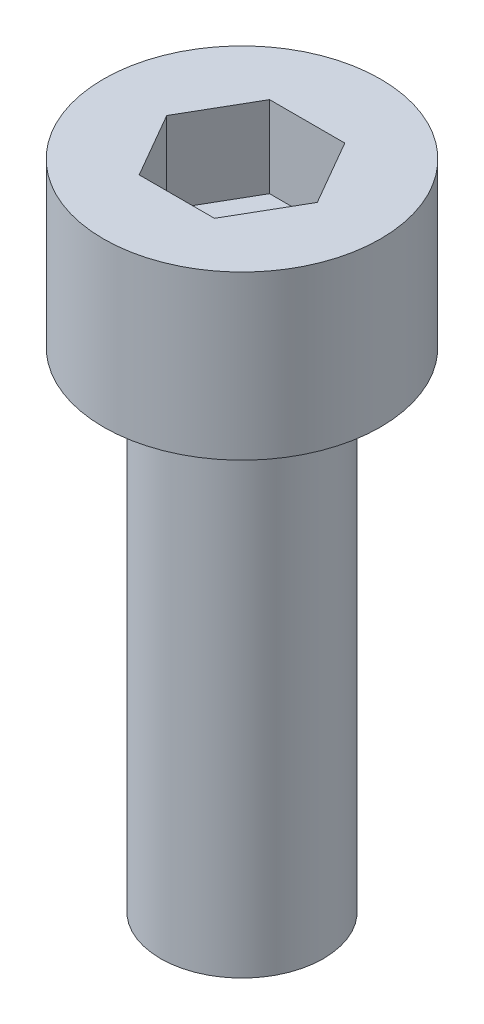
ISO-10303-21;
HEADER;
FILE_DESCRIPTION(('STEP AP214'),'2;1');
FILE_NAME('part.step','',(''),(''),'','','');
FILE_SCHEMA(('AUTOMOTIVE_DESIGN { 1 0 10303 214 1 1 1 1 }'));
ENDSEC;
DATA;
#1=APPLICATION_CONTEXT('core data for automotive mechanical design processes');
#2=APPLICATION_PROTOCOL_DEFINITION('international standard','automotive_design',2000,#1);
#3=PRODUCT_CONTEXT('',#1,'mechanical');
#4=PRODUCT('Part','Part','',(#3));
#5=PRODUCT_RELATED_PRODUCT_CATEGORY('part','',(#4));
#6=PRODUCT_DEFINITION_FORMATION('','',#4);
#7=PRODUCT_DEFINITION_CONTEXT('part definition',#1,'design');
#8=PRODUCT_DEFINITION('design','',#6,#7);
#9=PRODUCT_DEFINITION_SHAPE('','',#8);
#10=(LENGTH_UNIT() NAMED_UNIT(*) SI_UNIT(.MILLI.,.METRE.));
#11=(NAMED_UNIT(*) PLANE_ANGLE_UNIT() SI_UNIT($,.RADIAN.));
#12=(NAMED_UNIT(*) SI_UNIT($,.STERADIAN.) SOLID_ANGLE_UNIT());
#13=UNCERTAINTY_MEASURE_WITH_UNIT(LENGTH_MEASURE(1.E-05),#10,'distance_accuracy_value','');
#14=(GEOMETRIC_REPRESENTATION_CONTEXT(3) GLOBAL_UNCERTAINTY_ASSIGNED_CONTEXT((#13)) GLOBAL_UNIT_ASSIGNED_CONTEXT((#10,
#11,#12)) REPRESENTATION_CONTEXT('',''));
#15=CARTESIAN_POINT('',(0.,0.,0.));
#16=DIRECTION('',(0.,0.,1.));
#17=DIRECTION('',(1.,0.,0.));
#18=AXIS2_PLACEMENT_3D('',#15,#16,#17);
#19=CARTESIAN_POINT('',(0.,0.,0.));
#20=DIRECTION('',(0.,1.,0.));
#21=DIRECTION('',(0.,0.,1.));
#22=AXIS2_PLACEMENT_3D('',#19,#20,#21);
#23=PLANE('',#22);
#24=CARTESIAN_POINT('',(0.,0.,0.));
#25=DIRECTION('',(0.,1.,0.));
#26=DIRECTION('',(0.,0.,1.));
#27=AXIS2_PLACEMENT_3D('',#24,#25,#26);
#28=CIRCLE('',#27,2.5);
#29=CARTESIAN_POINT('',(0.,0.,2.5));
#30=VERTEX_POINT('',#29);
#31=EDGE_CURVE('E11',#30,#30,#28,.T.);
#32=ORIENTED_EDGE('',*,*,#31,.F.);
#33=EDGE_LOOP('',(#32));
#34=FACE_BOUND('',#33,.T.);
#35=ADVANCED_FACE('F33',(#34),#23,.F.);
#36=CARTESIAN_POINT('',(0.,20.,0.));
#37=DIRECTION('',(0.,1.,0.));
#38=DIRECTION('',(0.,0.,1.));
#39=AXIS2_PLACEMENT_3D('',#36,#37,#38);
#40=CYLINDRICAL_SURFACE('',#39,2.5);
#41=CARTESIAN_POINT('',(0.,15.,0.));
#42=DIRECTION('',(0.,1.,0.));
#43=DIRECTION('',(0.,0.,1.));
#44=AXIS2_PLACEMENT_3D('',#41,#42,#43);
#45=CIRCLE('',#44,2.5);
#46=CARTESIAN_POINT('',(0.,15.,2.5));
#47=VERTEX_POINT('',#46);
#48=EDGE_CURVE('E40',#47,#47,#45,.T.);
#49=ORIENTED_EDGE('',*,*,#48,.F.);
#50=EDGE_LOOP('',(#49));
#51=FACE_BOUND('',#50,.T.);
#52=ORIENTED_EDGE('',*,*,#31,.T.);
#53=EDGE_LOOP('',(#52));
#54=FACE_BOUND('',#53,.T.);
#55=ADVANCED_FACE('F149',(#51,#54),#40,.T.);
#56=CARTESIAN_POINT('',(2.5,15.,0.));
#57=DIRECTION('',(0.,1.,0.));
#58=DIRECTION('',(0.,0.,1.));
#59=AXIS2_PLACEMENT_3D('',#56,#57,#58);
#60=PLANE('',#59);
#61=CARTESIAN_POINT('',(0.,15.,0.));
#62=DIRECTION('',(0.,1.,0.));
#63=DIRECTION('',(0.,0.,1.));
#64=AXIS2_PLACEMENT_3D('',#61,#62,#63);
#65=CIRCLE('',#64,4.25);
#66=CARTESIAN_POINT('',(0.,15.,4.25));
#67=VERTEX_POINT('',#66);
#68=EDGE_CURVE('E142',#67,#67,#65,.T.);
#69=ORIENTED_EDGE('',*,*,#68,.F.);
#70=EDGE_LOOP('',(#69));
#71=FACE_BOUND('',#70,.T.);
#72=ORIENTED_EDGE('',*,*,#48,.T.);
#73=EDGE_LOOP('',(#72));
#74=FACE_BOUND('',#73,.T.);
#75=ADVANCED_FACE('F147',(#71,#74),#60,.F.);
#76=CARTESIAN_POINT('',(0.,20.,0.));
#77=DIRECTION('',(0.,1.,0.));
#78=DIRECTION('',(0.,0.,1.));
#79=AXIS2_PLACEMENT_3D('',#76,#77,#78);
#80=CYLINDRICAL_SURFACE('',#79,4.25);
#81=CARTESIAN_POINT('',(0.,20.,0.));
#82=DIRECTION('',(0.,1.,0.));
#83=DIRECTION('',(0.,0.,1.));
#84=AXIS2_PLACEMENT_3D('',#81,#82,#83);
#85=CIRCLE('',#84,4.25);
#86=CARTESIAN_POINT('',(0.,20.,4.25));
#87=VERTEX_POINT('',#86);
#88=EDGE_CURVE('E134',#87,#87,#85,.T.);
#89=ORIENTED_EDGE('',*,*,#88,.F.);
#90=EDGE_LOOP('',(#89));
#91=FACE_BOUND('',#90,.T.);
#92=ORIENTED_EDGE('',*,*,#68,.T.);
#93=EDGE_LOOP('',(#92));
#94=FACE_BOUND('',#93,.T.);
#95=ADVANCED_FACE('F167',(#91,#94),#80,.T.);
#96=CARTESIAN_POINT('',(4.25,20.,0.));
#97=DIRECTION('',(0.,-1.,0.));
#98=DIRECTION('',(0.,0.,-1.));
#99=AXIS2_PLACEMENT_3D('',#96,#97,#98);
#100=PLANE('',#99);
#101=DIRECTION('',(-1.,0.,0.));
#102=VECTOR('',#101,1.);
#103=CARTESIAN_POINT('',(1.15470053837925,20.,-2.));
#104=LINE('',#103,#102);
#105=CARTESIAN_POINT('',(1.15470053837925,20.,-2.));
#106=VERTEX_POINT('',#105);
#107=CARTESIAN_POINT('',(-1.15470053837925,20.,-2.));
#108=VERTEX_POINT('',#107);
#109=EDGE_CURVE('E121',#106,#108,#104,.T.);
#110=ORIENTED_EDGE('',*,*,#109,.F.);
#111=DIRECTION('',(-0.5,0.,-0.866025403784438));
#112=VECTOR('',#111,1.);
#113=CARTESIAN_POINT('',(2.3094010767585,20.,0.));
#114=LINE('',#113,#112);
#115=CARTESIAN_POINT('',(2.3094010767585,20.,0.));
#116=VERTEX_POINT('',#115);
#117=EDGE_CURVE('E47',#116,#106,#114,.T.);
#118=ORIENTED_EDGE('',*,*,#117,.F.);
#119=DIRECTION('',(0.5,0.,-0.866025403784439));
#120=VECTOR('',#119,1.);
#121=CARTESIAN_POINT('',(1.15470053837925,20.,2.));
#122=LINE('',#121,#120);
#123=CARTESIAN_POINT('',(1.15470053837925,20.,2.));
#124=VERTEX_POINT('',#123);
#125=EDGE_CURVE('E130',#124,#116,#122,.T.);
#126=ORIENTED_EDGE('',*,*,#125,.F.);
#127=DIRECTION('',(1.,0.,0.));
#128=VECTOR('',#127,1.);
#129=CARTESIAN_POINT('',(-1.15470053837925,20.,2.));
#130=LINE('',#129,#128);
#131=CARTESIAN_POINT('',(-1.15470053837925,20.,2.));
#132=VERTEX_POINT('',#131);
#133=EDGE_CURVE('E128',#132,#124,#130,.T.);
#134=ORIENTED_EDGE('',*,*,#133,.F.);
#135=DIRECTION('',(0.5,0.,0.866025403784439));
#136=VECTOR('',#135,1.);
#137=CARTESIAN_POINT('',(-2.3094010767585,20.,0.));
#138=LINE('',#137,#136);
#139=CARTESIAN_POINT('',(-2.3094010767585,20.,0.));
#140=VERTEX_POINT('',#139);
#141=EDGE_CURVE('E95',#140,#132,#138,.T.);
#142=ORIENTED_EDGE('',*,*,#141,.F.);
#143=DIRECTION('',(-0.5,0.,0.866025403784438));
#144=VECTOR('',#143,1.);
#145=CARTESIAN_POINT('',(-1.15470053837925,20.,-2.));
#146=LINE('',#145,#144);
#147=EDGE_CURVE('E124',#108,#140,#146,.T.);
#148=ORIENTED_EDGE('',*,*,#147,.F.);
#149=EDGE_LOOP('',(#110,#118,#126,#134,#142,#148));
#150=FACE_BOUND('',#149,.T.);
#151=ORIENTED_EDGE('',*,*,#88,.T.);
#152=EDGE_LOOP('',(#151));
#153=FACE_BOUND('',#152,.T.);
#154=ADVANCED_FACE('F175',(#150,#153),#100,.F.);
#155=CARTESIAN_POINT('',(2.3094010767585,17.5,0.));
#156=DIRECTION('',(0.866025403784438,0.,-0.5));
#157=DIRECTION('',(-0.5,0.,-0.866025403784438));
#158=AXIS2_PLACEMENT_3D('',#155,#156,#157);
#159=PLANE('',#158);
#160=ORIENTED_EDGE('',*,*,#117,.T.);
#161=DIRECTION('',(0.,1.,0.));
#162=VECTOR('',#161,1.);
#163=CARTESIAN_POINT('',(1.15470053837925,17.5,-2.));
#164=LINE('',#163,#162);
#165=CARTESIAN_POINT('',(1.15470053837925,17.5,-2.));
#166=VERTEX_POINT('',#165);
#167=EDGE_CURVE('E77',#166,#106,#164,.T.);
#168=ORIENTED_EDGE('',*,*,#167,.F.);
#169=DIRECTION('',(-0.5,0.,-0.866025403784438));
#170=VECTOR('',#169,1.);
#171=CARTESIAN_POINT('',(2.3094010767585,17.5,0.));
#172=LINE('',#171,#170);
#173=CARTESIAN_POINT('',(2.3094010767585,17.5,0.));
#174=VERTEX_POINT('',#173);
#175=EDGE_CURVE('E132',#174,#166,#172,.T.);
#176=ORIENTED_EDGE('',*,*,#175,.F.);
#177=DIRECTION('',(0.,1.,0.));
#178=VECTOR('',#177,1.);
#179=CARTESIAN_POINT('',(2.3094010767585,17.5,0.));
#180=LINE('',#179,#178);
#181=EDGE_CURVE('E55',#174,#116,#180,.T.);
#182=ORIENTED_EDGE('',*,*,#181,.T.);
#183=EDGE_LOOP('',(#160,#168,#176,#182));
#184=FACE_BOUND('',#183,.T.);
#185=ADVANCED_FACE('F183',(#184),#159,.F.);
#186=CARTESIAN_POINT('',(1.15470053837925,17.5,2.));
#187=DIRECTION('',(0.866025403784439,0.,0.5));
#188=DIRECTION('',(0.5,0.,-0.866025403784439));
#189=AXIS2_PLACEMENT_3D('',#186,#187,#188);
#190=PLANE('',#189);
#191=ORIENTED_EDGE('',*,*,#125,.T.);
#192=ORIENTED_EDGE('',*,*,#181,.F.);
#193=DIRECTION('',(0.5,0.,-0.866025403784439));
#194=VECTOR('',#193,1.);
#195=CARTESIAN_POINT('',(1.15470053837925,17.5,2.));
#196=LINE('',#195,#194);
#197=CARTESIAN_POINT('',(1.15470053837925,17.5,2.));
#198=VERTEX_POINT('',#197);
#199=EDGE_CURVE('E107',#198,#174,#196,.T.);
#200=ORIENTED_EDGE('',*,*,#199,.F.);
#201=DIRECTION('',(0.,1.,0.));
#202=VECTOR('',#201,1.);
#203=CARTESIAN_POINT('',(1.15470053837925,17.5,2.));
#204=LINE('',#203,#202);
#205=EDGE_CURVE('E99',#198,#124,#204,.T.);
#206=ORIENTED_EDGE('',*,*,#205,.T.);
#207=EDGE_LOOP('',(#191,#192,#200,#206));
#208=FACE_BOUND('',#207,.T.);
#209=ADVANCED_FACE('F191',(#208),#190,.F.);
#210=CARTESIAN_POINT('',(-1.15470053837925,17.5,2.));
#211=DIRECTION('',(0.,0.,1.));
#212=DIRECTION('',(1.,0.,0.));
#213=AXIS2_PLACEMENT_3D('',#210,#211,#212);
#214=PLANE('',#213);
#215=ORIENTED_EDGE('',*,*,#133,.T.);
#216=ORIENTED_EDGE('',*,*,#205,.F.);
#217=DIRECTION('',(1.,0.,0.));
#218=VECTOR('',#217,1.);
#219=CARTESIAN_POINT('',(-1.15470053837925,17.5,2.));
#220=LINE('',#219,#218);
#221=CARTESIAN_POINT('',(-1.15470053837925,17.5,2.));
#222=VERTEX_POINT('',#221);
#223=EDGE_CURVE('E103',#222,#198,#220,.T.);
#224=ORIENTED_EDGE('',*,*,#223,.F.);
#225=DIRECTION('',(0.,1.,0.));
#226=VECTOR('',#225,1.);
#227=CARTESIAN_POINT('',(-1.15470053837925,17.5,2.));
#228=LINE('',#227,#226);
#229=EDGE_CURVE('E88',#222,#132,#228,.T.);
#230=ORIENTED_EDGE('',*,*,#229,.T.);
#231=EDGE_LOOP('',(#215,#216,#224,#230));
#232=FACE_BOUND('',#231,.T.);
#233=ADVANCED_FACE('F104',(#232),#214,.F.);
#234=CARTESIAN_POINT('',(-2.3094010767585,17.5,0.));
#235=DIRECTION('',(-0.866025403784438,0.,0.5));
#236=DIRECTION('',(0.5,0.,0.866025403784439));
#237=AXIS2_PLACEMENT_3D('',#234,#235,#236);
#238=PLANE('',#237);
#239=ORIENTED_EDGE('',*,*,#141,.T.);
#240=ORIENTED_EDGE('',*,*,#229,.F.);
#241=DIRECTION('',(0.5,0.,0.866025403784439));
#242=VECTOR('',#241,1.);
#243=CARTESIAN_POINT('',(-2.3094010767585,17.5,0.));
#244=LINE('',#243,#242);
#245=CARTESIAN_POINT('',(-2.3094010767585,17.5,0.));
#246=VERTEX_POINT('',#245);
#247=EDGE_CURVE('E92',#246,#222,#244,.T.);
#248=ORIENTED_EDGE('',*,*,#247,.F.);
#249=DIRECTION('',(0.,1.,0.));
#250=VECTOR('',#249,1.);
#251=CARTESIAN_POINT('',(-2.3094010767585,17.5,0.));
#252=LINE('',#251,#250);
#253=EDGE_CURVE('E100',#246,#140,#252,.T.);
#254=ORIENTED_EDGE('',*,*,#253,.T.);
#255=EDGE_LOOP('',(#239,#240,#248,#254));
#256=FACE_BOUND('',#255,.T.);
#257=ADVANCED_FACE('F90',(#256),#238,.F.);
#258=CARTESIAN_POINT('',(-1.15470053837925,17.5,-2.));
#259=DIRECTION('',(-0.866025403784439,0.,-0.5));
#260=DIRECTION('',(-0.5,0.,0.866025403784439));
#261=AXIS2_PLACEMENT_3D('',#258,#259,#260);
#262=PLANE('',#261);
#263=ORIENTED_EDGE('',*,*,#147,.T.);
#264=ORIENTED_EDGE('',*,*,#253,.F.);
#265=DIRECTION('',(-0.5,0.,0.866025403784438));
#266=VECTOR('',#265,1.);
#267=CARTESIAN_POINT('',(-1.15470053837925,17.5,-2.));
#268=LINE('',#267,#266);
#269=CARTESIAN_POINT('',(-1.15470053837925,17.5,-2.));
#270=VERTEX_POINT('',#269);
#271=EDGE_CURVE('E113',#270,#246,#268,.T.);
#272=ORIENTED_EDGE('',*,*,#271,.F.);
#273=DIRECTION('',(0.,1.,0.));
#274=VECTOR('',#273,1.);
#275=CARTESIAN_POINT('',(-1.15470053837925,17.5,-2.));
#276=LINE('',#275,#274);
#277=EDGE_CURVE('E137',#270,#108,#276,.T.);
#278=ORIENTED_EDGE('',*,*,#277,.T.);
#279=EDGE_LOOP('',(#263,#264,#272,#278));
#280=FACE_BOUND('',#279,.T.);
#281=ADVANCED_FACE('F210',(#280),#262,.F.);
#282=CARTESIAN_POINT('',(1.15470053837925,17.5,-2.));
#283=DIRECTION('',(0.,0.,-1.));
#284=DIRECTION('',(-1.,0.,0.));
#285=AXIS2_PLACEMENT_3D('',#282,#283,#284);
#286=PLANE('',#285);
#287=ORIENTED_EDGE('',*,*,#109,.T.);
#288=ORIENTED_EDGE('',*,*,#277,.F.);
#289=DIRECTION('',(-1.,0.,0.));
#290=VECTOR('',#289,1.);
#291=CARTESIAN_POINT('',(1.15470053837925,17.5,-2.));
#292=LINE('',#291,#290);
#293=EDGE_CURVE('E115',#166,#270,#292,.T.);
#294=ORIENTED_EDGE('',*,*,#293,.F.);
#295=ORIENTED_EDGE('',*,*,#167,.T.);
#296=EDGE_LOOP('',(#287,#288,#294,#295));
#297=FACE_BOUND('',#296,.T.);
#298=ADVANCED_FACE('F217',(#297),#286,.F.);
#299=CARTESIAN_POINT('',(0.,17.5,0.));
#300=DIRECTION('',(0.,1.,0.));
#301=DIRECTION('',(0.,0.,1.));
#302=AXIS2_PLACEMENT_3D('',#299,#300,#301);
#303=PLANE('',#302);
#304=ORIENTED_EDGE('',*,*,#175,.T.);
#305=ORIENTED_EDGE('',*,*,#293,.T.);
#306=ORIENTED_EDGE('',*,*,#271,.T.);
#307=ORIENTED_EDGE('',*,*,#247,.T.);
#308=ORIENTED_EDGE('',*,*,#223,.T.);
#309=ORIENTED_EDGE('',*,*,#199,.T.);
#310=EDGE_LOOP('',(#304,#305,#306,#307,#308,#309));
#311=FACE_BOUND('',#310,.T.);
#312=ADVANCED_FACE('F110',(#311),#303,.T.);
#313=CLOSED_SHELL('',(#35,#55,#75,#95,#154,#185,#209,#233,#257,#281,#298,#312));
#314=MANIFOLD_SOLID_BREP('B2',#313);
#315=ADVANCED_BREP_SHAPE_REPRESENTATION('',(#18,#314),#14);
#316=SHAPE_DEFINITION_REPRESENTATION(#9,#315);
ENDSEC;
END-ISO-10303-21;
